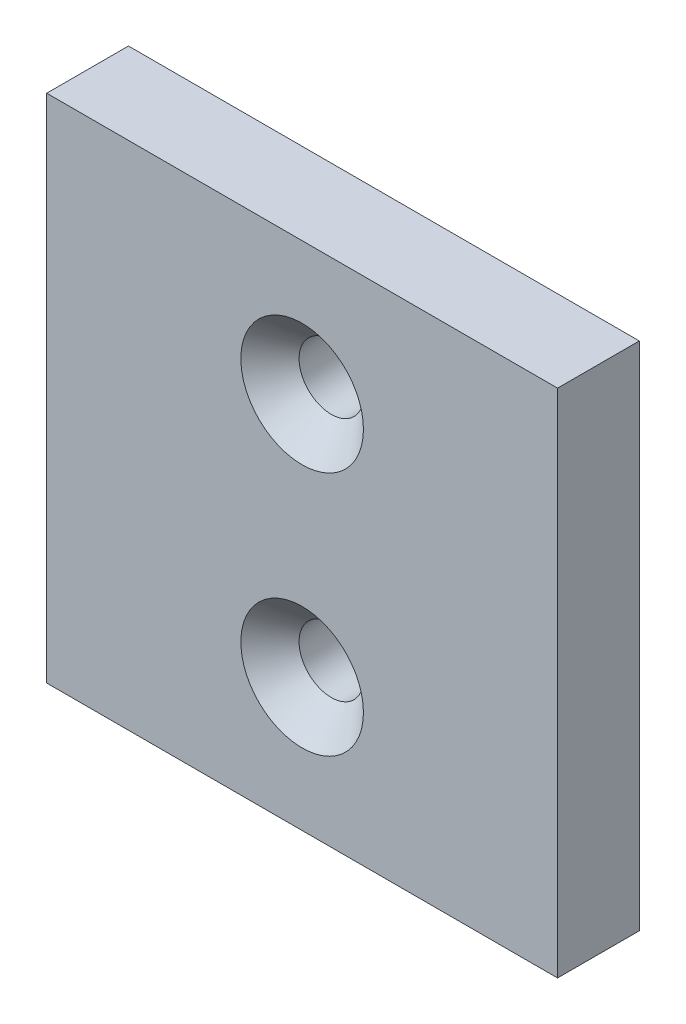
ISO-10303-21;
HEADER;
FILE_DESCRIPTION(('STEP AP214'),'2;1');
FILE_NAME('part.step','',(''),(''),'','','');
FILE_SCHEMA(('AUTOMOTIVE_DESIGN { 1 0 10303 214 1 1 1 1 }'));
ENDSEC;
DATA;
#1=APPLICATION_CONTEXT('core data for automotive mechanical design processes');
#2=APPLICATION_PROTOCOL_DEFINITION('international standard','automotive_design',2000,#1);
#3=PRODUCT_CONTEXT('',#1,'mechanical');
#4=PRODUCT('Part','Part','',(#3));
#5=PRODUCT_RELATED_PRODUCT_CATEGORY('part','',(#4));
#6=PRODUCT_DEFINITION_FORMATION('','',#4);
#7=PRODUCT_DEFINITION_CONTEXT('part definition',#1,'design');
#8=PRODUCT_DEFINITION('design','',#6,#7);
#9=PRODUCT_DEFINITION_SHAPE('','',#8);
#10=(LENGTH_UNIT() NAMED_UNIT(*) SI_UNIT(.MILLI.,.METRE.));
#11=(NAMED_UNIT(*) PLANE_ANGLE_UNIT() SI_UNIT($,.RADIAN.));
#12=(NAMED_UNIT(*) SI_UNIT($,.STERADIAN.) SOLID_ANGLE_UNIT());
#13=UNCERTAINTY_MEASURE_WITH_UNIT(LENGTH_MEASURE(1.E-05),#10,'distance_accuracy_value','');
#14=(GEOMETRIC_REPRESENTATION_CONTEXT(3) GLOBAL_UNCERTAINTY_ASSIGNED_CONTEXT((#13)) GLOBAL_UNIT_ASSIGNED_CONTEXT((#10,
#11,#12)) REPRESENTATION_CONTEXT('',''));
#15=CARTESIAN_POINT('',(0.,0.,0.));
#16=DIRECTION('',(0.,0.,1.));
#17=DIRECTION('',(1.,0.,0.));
#18=AXIS2_PLACEMENT_3D('',#15,#16,#17);
#19=CARTESIAN_POINT('',(25.,-25.,8.));
#20=DIRECTION('',(-1.,0.,0.));
#21=DIRECTION('',(0.,0.,1.));
#22=AXIS2_PLACEMENT_3D('',#19,#20,#21);
#23=PLANE('',#22);
#24=DIRECTION('',(0.,1.,0.));
#25=VECTOR('',#24,1.);
#26=CARTESIAN_POINT('',(25.,-25.,0.));
#27=LINE('',#26,#25);
#28=CARTESIAN_POINT('',(25.,-25.,0.));
#29=VERTEX_POINT('',#28);
#30=CARTESIAN_POINT('',(25.,25.,0.));
#31=VERTEX_POINT('',#30);
#32=EDGE_CURVE('E98',#29,#31,#27,.T.);
#33=ORIENTED_EDGE('',*,*,#32,.T.);
#34=DIRECTION('',(0.,0.,-1.));
#35=VECTOR('',#34,1.);
#36=CARTESIAN_POINT('',(25.,25.,8.));
#37=LINE('',#36,#35);
#38=CARTESIAN_POINT('',(25.,25.,8.));
#39=VERTEX_POINT('',#38);
#40=EDGE_CURVE('E11',#39,#31,#37,.T.);
#41=ORIENTED_EDGE('',*,*,#40,.F.);
#42=DIRECTION('',(0.,1.,0.));
#43=VECTOR('',#42,1.);
#44=CARTESIAN_POINT('',(25.,-25.,8.));
#45=LINE('',#44,#43);
#46=CARTESIAN_POINT('',(25.,-25.,8.));
#47=VERTEX_POINT('',#46);
#48=EDGE_CURVE('E86',#47,#39,#45,.T.);
#49=ORIENTED_EDGE('',*,*,#48,.F.);
#50=DIRECTION('',(0.,0.,-1.));
#51=VECTOR('',#50,1.);
#52=CARTESIAN_POINT('',(25.,-25.,8.));
#53=LINE('',#52,#51);
#54=EDGE_CURVE('E94',#47,#29,#53,.T.);
#55=ORIENTED_EDGE('',*,*,#54,.T.);
#56=EDGE_LOOP('',(#33,#41,#49,#55));
#57=FACE_BOUND('',#56,.T.);
#58=ADVANCED_FACE('F35',(#57),#23,.F.);
#59=CARTESIAN_POINT('',(-25.,25.,8.));
#60=DIRECTION('',(0.,-1.,0.));
#61=DIRECTION('',(0.,0.,-1.));
#62=AXIS2_PLACEMENT_3D('',#59,#60,#61);
#63=PLANE('',#62);
#64=DIRECTION('',(-1.,0.,0.));
#65=VECTOR('',#64,1.);
#66=CARTESIAN_POINT('',(-25.,25.,0.));
#67=LINE('',#66,#65);
#68=CARTESIAN_POINT('',(-25.,25.,0.));
#69=VERTEX_POINT('',#68);
#70=EDGE_CURVE('E90',#31,#69,#67,.T.);
#71=ORIENTED_EDGE('',*,*,#70,.T.);
#72=DIRECTION('',(0.,0.,-1.));
#73=VECTOR('',#72,1.);
#74=CARTESIAN_POINT('',(-25.,25.,8.));
#75=LINE('',#74,#73);
#76=CARTESIAN_POINT('',(-25.,25.,8.));
#77=VERTEX_POINT('',#76);
#78=EDGE_CURVE('E43',#77,#69,#75,.T.);
#79=ORIENTED_EDGE('',*,*,#78,.F.);
#80=DIRECTION('',(-1.,0.,0.));
#81=VECTOR('',#80,1.);
#82=CARTESIAN_POINT('',(-25.,25.,8.));
#83=LINE('',#82,#81);
#84=EDGE_CURVE('E81',#39,#77,#83,.T.);
#85=ORIENTED_EDGE('',*,*,#84,.F.);
#86=ORIENTED_EDGE('',*,*,#40,.T.);
#87=EDGE_LOOP('',(#71,#79,#85,#86));
#88=FACE_BOUND('',#87,.T.);
#89=ADVANCED_FACE('F89',(#88),#63,.F.);
#90=CARTESIAN_POINT('',(-25.,-25.,8.));
#91=DIRECTION('',(1.,0.,0.));
#92=DIRECTION('',(0.,0.,-1.));
#93=AXIS2_PLACEMENT_3D('',#90,#91,#92);
#94=PLANE('',#93);
#95=DIRECTION('',(0.,-1.,0.));
#96=VECTOR('',#95,1.);
#97=CARTESIAN_POINT('',(-25.,-25.,0.));
#98=LINE('',#97,#96);
#99=CARTESIAN_POINT('',(-25.,-25.,0.));
#100=VERTEX_POINT('',#99);
#101=EDGE_CURVE('E68',#69,#100,#98,.T.);
#102=ORIENTED_EDGE('',*,*,#101,.T.);
#103=DIRECTION('',(0.,0.,-1.));
#104=VECTOR('',#103,1.);
#105=CARTESIAN_POINT('',(-25.,-25.,8.));
#106=LINE('',#105,#104);
#107=CARTESIAN_POINT('',(-25.,-25.,8.));
#108=VERTEX_POINT('',#107);
#109=EDGE_CURVE('E91',#108,#100,#106,.T.);
#110=ORIENTED_EDGE('',*,*,#109,.F.);
#111=DIRECTION('',(0.,-1.,0.));
#112=VECTOR('',#111,1.);
#113=CARTESIAN_POINT('',(-25.,-25.,8.));
#114=LINE('',#113,#112);
#115=EDGE_CURVE('E84',#77,#108,#114,.T.);
#116=ORIENTED_EDGE('',*,*,#115,.F.);
#117=ORIENTED_EDGE('',*,*,#78,.T.);
#118=EDGE_LOOP('',(#102,#110,#116,#117));
#119=FACE_BOUND('',#118,.T.);
#120=ADVANCED_FACE('F92',(#119),#94,.F.);
#121=CARTESIAN_POINT('',(-25.,-25.,8.));
#122=DIRECTION('',(0.,1.,0.));
#123=DIRECTION('',(0.,0.,1.));
#124=AXIS2_PLACEMENT_3D('',#121,#122,#123);
#125=PLANE('',#124);
#126=DIRECTION('',(1.,0.,0.));
#127=VECTOR('',#126,1.);
#128=CARTESIAN_POINT('',(-25.,-25.,0.));
#129=LINE('',#128,#127);
#130=EDGE_CURVE('E74',#100,#29,#129,.T.);
#131=ORIENTED_EDGE('',*,*,#130,.T.);
#132=ORIENTED_EDGE('',*,*,#54,.F.);
#133=DIRECTION('',(1.,0.,0.));
#134=VECTOR('',#133,1.);
#135=CARTESIAN_POINT('',(-25.,-25.,8.));
#136=LINE('',#135,#134);
#137=EDGE_CURVE('E51',#108,#47,#136,.T.);
#138=ORIENTED_EDGE('',*,*,#137,.F.);
#139=ORIENTED_EDGE('',*,*,#109,.T.);
#140=EDGE_LOOP('',(#131,#132,#138,#139));
#141=FACE_BOUND('',#140,.T.);
#142=ADVANCED_FACE('F106',(#141),#125,.F.);
#143=CARTESIAN_POINT('',(0.,0.,8.));
#144=DIRECTION('',(0.,0.,-1.));
#145=DIRECTION('',(-1.,0.,0.));
#146=AXIS2_PLACEMENT_3D('',#143,#144,#145);
#147=PLANE('',#146);
#148=CARTESIAN_POINT('',(0.,12.,8.));
#149=DIRECTION('',(0.,0.,1.));
#150=DIRECTION('',(1.,0.,0.));
#151=AXIS2_PLACEMENT_3D('',#148,#149,#150);
#152=CIRCLE('',#151,6.);
#153=CARTESIAN_POINT('',(6.,12.,8.));
#154=VERTEX_POINT('',#153);
#155=EDGE_CURVE('E126',#154,#154,#152,.T.);
#156=ORIENTED_EDGE('',*,*,#155,.F.);
#157=EDGE_LOOP('',(#156));
#158=FACE_BOUND('',#157,.T.);
#159=CARTESIAN_POINT('',(0.,-12.,8.));
#160=DIRECTION('',(0.,0.,1.));
#161=DIRECTION('',(1.,0.,0.));
#162=AXIS2_PLACEMENT_3D('',#159,#160,#161);
#163=CIRCLE('',#162,6.);
#164=CARTESIAN_POINT('',(6.,-12.,8.));
#165=VERTEX_POINT('',#164);
#166=EDGE_CURVE('E117',#165,#165,#163,.T.);
#167=ORIENTED_EDGE('',*,*,#166,.F.);
#168=EDGE_LOOP('',(#167));
#169=FACE_BOUND('',#168,.T.);
#170=ORIENTED_EDGE('',*,*,#48,.T.);
#171=ORIENTED_EDGE('',*,*,#84,.T.);
#172=ORIENTED_EDGE('',*,*,#115,.T.);
#173=ORIENTED_EDGE('',*,*,#137,.T.);
#174=EDGE_LOOP('',(#170,#171,#172,#173));
#175=FACE_BOUND('',#174,.T.);
#176=ADVANCED_FACE('F82',(#158,#169,#175),#147,.F.);
#177=CARTESIAN_POINT('',(0.,0.,0.));
#178=DIRECTION('',(0.,0.,-1.));
#179=DIRECTION('',(-1.,0.,0.));
#180=AXIS2_PLACEMENT_3D('',#177,#178,#179);
#181=PLANE('',#180);
#182=CARTESIAN_POINT('',(0.,12.,0.));
#183=DIRECTION('',(0.,0.,1.));
#184=DIRECTION('',(1.,0.,0.));
#185=AXIS2_PLACEMENT_3D('',#182,#183,#184);
#186=CIRCLE('',#185,3.15);
#187=CARTESIAN_POINT('',(3.15,12.,0.));
#188=VERTEX_POINT('',#187);
#189=EDGE_CURVE('E120',#188,#188,#186,.T.);
#190=ORIENTED_EDGE('',*,*,#189,.T.);
#191=EDGE_LOOP('',(#190));
#192=FACE_BOUND('',#191,.T.);
#193=CARTESIAN_POINT('',(0.,-12.,0.));
#194=DIRECTION('',(0.,0.,1.));
#195=DIRECTION('',(1.,0.,0.));
#196=AXIS2_PLACEMENT_3D('',#193,#194,#195);
#197=CIRCLE('',#196,3.15);
#198=CARTESIAN_POINT('',(3.15,-12.,0.));
#199=VERTEX_POINT('',#198);
#200=EDGE_CURVE('E101',#199,#199,#197,.T.);
#201=ORIENTED_EDGE('',*,*,#200,.T.);
#202=EDGE_LOOP('',(#201));
#203=FACE_BOUND('',#202,.T.);
#204=ORIENTED_EDGE('',*,*,#32,.F.);
#205=ORIENTED_EDGE('',*,*,#130,.F.);
#206=ORIENTED_EDGE('',*,*,#101,.F.);
#207=ORIENTED_EDGE('',*,*,#70,.F.);
#208=EDGE_LOOP('',(#204,#205,#206,#207));
#209=FACE_BOUND('',#208,.T.);
#210=ADVANCED_FACE('F109',(#192,#203,#209),#181,.T.);
#211=CARTESIAN_POINT('',(0.,-12.,8.));
#212=DIRECTION('',(0.,0.,1.));
#213=DIRECTION('',(1.,0.,0.));
#214=AXIS2_PLACEMENT_3D('',#211,#212,#213);
#215=CYLINDRICAL_SURFACE('',#214,3.15);
#216=ORIENTED_EDGE('',*,*,#200,.F.);
#217=EDGE_LOOP('',(#216));
#218=FACE_BOUND('',#217,.T.);
#219=CARTESIAN_POINT('',(0.,-12.,5.15000000000001));
#220=DIRECTION('',(0.,0.,1.));
#221=DIRECTION('',(1.,0.,0.));
#222=AXIS2_PLACEMENT_3D('',#219,#220,#221);
#223=CIRCLE('',#222,3.15);
#224=CARTESIAN_POINT('',(3.15,-12.,5.15000000000001));
#225=VERTEX_POINT('',#224);
#226=EDGE_CURVE('E114',#225,#225,#223,.T.);
#227=ORIENTED_EDGE('',*,*,#226,.T.);
#228=EDGE_LOOP('',(#227));
#229=FACE_BOUND('',#228,.T.);
#230=ADVANCED_FACE('F140',(#218,#229),#215,.F.);
#231=CARTESIAN_POINT('',(0.,-12.,8.));
#232=DIRECTION('',(0.,0.,1.));
#233=DIRECTION('',(1.,0.,0.));
#234=AXIS2_PLACEMENT_3D('',#231,#232,#233);
#235=CONICAL_SURFACE('',#234,6.,0.785398163397449);
#236=ORIENTED_EDGE('',*,*,#226,.F.);
#237=EDGE_LOOP('',(#236));
#238=FACE_BOUND('',#237,.T.);
#239=ORIENTED_EDGE('',*,*,#166,.T.);
#240=EDGE_LOOP('',(#239));
#241=FACE_BOUND('',#240,.T.);
#242=ADVANCED_FACE('F137',(#238,#241),#235,.F.);
#243=CARTESIAN_POINT('',(0.,12.,8.));
#244=DIRECTION('',(0.,0.,1.));
#245=DIRECTION('',(1.,0.,0.));
#246=AXIS2_PLACEMENT_3D('',#243,#244,#245);
#247=CYLINDRICAL_SURFACE('',#246,3.15);
#248=ORIENTED_EDGE('',*,*,#189,.F.);
#249=EDGE_LOOP('',(#248));
#250=FACE_BOUND('',#249,.T.);
#251=CARTESIAN_POINT('',(0.,12.,5.15000000000001));
#252=DIRECTION('',(0.,0.,1.));
#253=DIRECTION('',(1.,0.,0.));
#254=AXIS2_PLACEMENT_3D('',#251,#252,#253);
#255=CIRCLE('',#254,3.15);
#256=CARTESIAN_POINT('',(3.15,12.,5.15000000000001));
#257=VERTEX_POINT('',#256);
#258=EDGE_CURVE('E123',#257,#257,#255,.T.);
#259=ORIENTED_EDGE('',*,*,#258,.T.);
#260=EDGE_LOOP('',(#259));
#261=FACE_BOUND('',#260,.T.);
#262=ADVANCED_FACE('F139',(#250,#261),#247,.F.);
#263=CARTESIAN_POINT('',(0.,12.,8.));
#264=DIRECTION('',(0.,0.,1.));
#265=DIRECTION('',(1.,0.,0.));
#266=AXIS2_PLACEMENT_3D('',#263,#264,#265);
#267=CONICAL_SURFACE('',#266,6.,0.785398163397449);
#268=ORIENTED_EDGE('',*,*,#258,.F.);
#269=EDGE_LOOP('',(#268));
#270=FACE_BOUND('',#269,.T.);
#271=ORIENTED_EDGE('',*,*,#155,.T.);
#272=EDGE_LOOP('',(#271));
#273=FACE_BOUND('',#272,.T.);
#274=ADVANCED_FACE('F130',(#270,#273),#267,.F.);
#275=CLOSED_SHELL('',(#58,#89,#120,#142,#176,#210,#230,#242,#262,#274));
#276=MANIFOLD_SOLID_BREP('B2',#275);
#277=ADVANCED_BREP_SHAPE_REPRESENTATION('',(#18,#276),#14);
#278=SHAPE_DEFINITION_REPRESENTATION(#9,#277);
ENDSEC;
END-ISO-10303-21;
